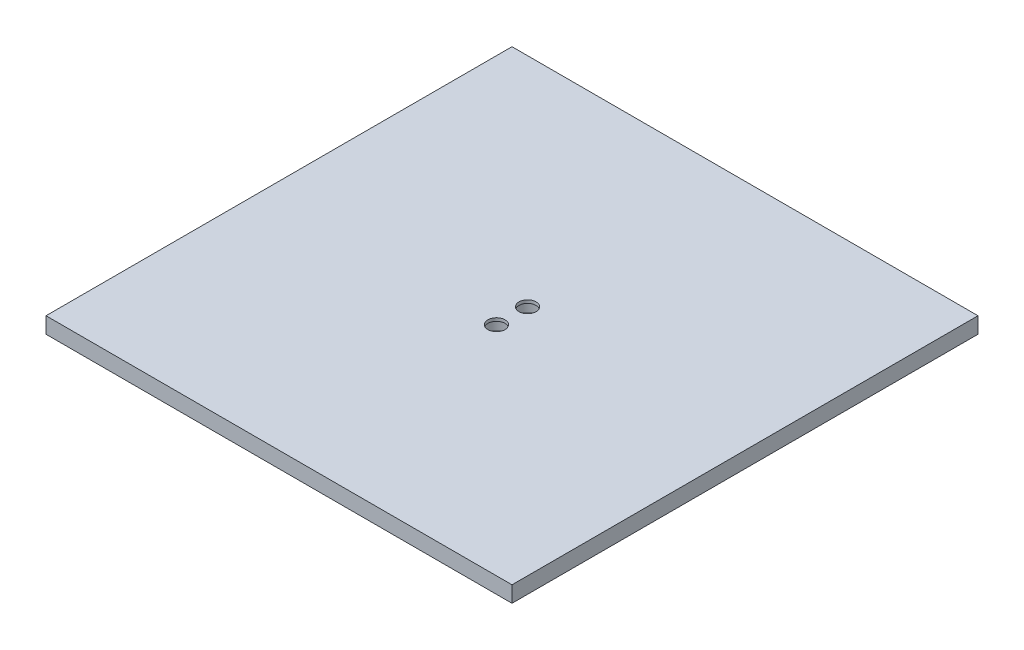
ISO-10303-21;
HEADER;
FILE_DESCRIPTION(('STEP AP214'),'2;1');
FILE_NAME('part.step','',(''),(''),'','','');
FILE_SCHEMA(('AUTOMOTIVE_DESIGN { 1 0 10303 214 1 1 1 1 }'));
ENDSEC;
DATA;
#1=APPLICATION_CONTEXT('core data for automotive mechanical design processes');
#2=APPLICATION_PROTOCOL_DEFINITION('international standard','automotive_design',2000,#1);
#3=PRODUCT_CONTEXT('',#1,'mechanical');
#4=PRODUCT('Part','Part','',(#3));
#5=PRODUCT_RELATED_PRODUCT_CATEGORY('part','',(#4));
#6=PRODUCT_DEFINITION_FORMATION('','',#4);
#7=PRODUCT_DEFINITION_CONTEXT('part definition',#1,'design');
#8=PRODUCT_DEFINITION('design','',#6,#7);
#9=PRODUCT_DEFINITION_SHAPE('','',#8);
#10=(LENGTH_UNIT() NAMED_UNIT(*) SI_UNIT(.MILLI.,.METRE.));
#11=(NAMED_UNIT(*) PLANE_ANGLE_UNIT() SI_UNIT($,.RADIAN.));
#12=(NAMED_UNIT(*) SI_UNIT($,.STERADIAN.) SOLID_ANGLE_UNIT());
#13=UNCERTAINTY_MEASURE_WITH_UNIT(LENGTH_MEASURE(1.E-05),#10,'distance_accuracy_value','');
#14=(GEOMETRIC_REPRESENTATION_CONTEXT(3) GLOBAL_UNCERTAINTY_ASSIGNED_CONTEXT((#13)) GLOBAL_UNIT_ASSIGNED_CONTEXT((#10,
#11,#12)) REPRESENTATION_CONTEXT('',''));
#15=CARTESIAN_POINT('',(0.,0.,0.));
#16=DIRECTION('',(0.,0.,1.));
#17=DIRECTION('',(1.,0.,0.));
#18=AXIS2_PLACEMENT_3D('',#15,#16,#17);
#19=CARTESIAN_POINT('',(45.,0.,-48.));
#20=DIRECTION('',(0.,-1.,0.));
#21=DIRECTION('',(0.,0.,-1.));
#22=AXIS2_PLACEMENT_3D('',#19,#20,#21);
#23=CYLINDRICAL_SURFACE('',#22,1.65);
#24=CARTESIAN_POINT('',(45.,0.,-48.));
#25=DIRECTION('',(0.,-1.,0.));
#26=DIRECTION('',(0.,0.,-1.));
#27=AXIS2_PLACEMENT_3D('',#24,#25,#26);
#28=CIRCLE('',#27,1.65);
#29=CARTESIAN_POINT('',(45.,0.,-49.65));
#30=VERTEX_POINT('',#29);
#31=EDGE_CURVE('E144',#30,#30,#28,.T.);
#32=CARTESIAN_POINT('',(45.,-0.6,-48.));
#33=DIRECTION('',(0.,-1.,0.));
#34=DIRECTION('',(0.,0.,-1.));
#35=AXIS2_PLACEMENT_3D('',#32,#33,#34);
#36=CIRCLE('',#35,1.65);
#37=CARTESIAN_POINT('',(45.,-0.6,-49.65));
#38=VERTEX_POINT('',#37);
#39=EDGE_CURVE('E49',#38,#38,#36,.F.);
#40=CARTESIAN_POINT('',(45.,0.,-49.65));
#41=CARTESIAN_POINT('',(45.,-0.00625,-49.65));
#42=CARTESIAN_POINT('',(45.,-0.0125,-49.65));
#43=CARTESIAN_POINT('',(45.,-0.025,-49.65));
#44=CARTESIAN_POINT('',(45.,-0.03125,-49.65));
#45=CARTESIAN_POINT('',(45.,-0.04375,-49.65));
#46=CARTESIAN_POINT('',(45.,-0.05,-49.65));
#47=CARTESIAN_POINT('',(45.,-0.0625,-49.65));
#48=CARTESIAN_POINT('',(45.,-0.06875,-49.65));
#49=CARTESIAN_POINT('',(45.,-0.08125,-49.65));
#50=CARTESIAN_POINT('',(45.,-0.0875,-49.65));
#51=CARTESIAN_POINT('',(45.,-0.1,-49.65));
#52=CARTESIAN_POINT('',(45.,-0.10625,-49.65));
#53=CARTESIAN_POINT('',(45.,-0.11875,-49.65));
#54=CARTESIAN_POINT('',(45.,-0.125,-49.65));
#55=CARTESIAN_POINT('',(45.,-0.1375,-49.65));
#56=CARTESIAN_POINT('',(45.,-0.14375,-49.65));
#57=CARTESIAN_POINT('',(45.,-0.15625,-49.65));
#58=CARTESIAN_POINT('',(45.,-0.1625,-49.65));
#59=CARTESIAN_POINT('',(45.,-0.175,-49.65));
#60=CARTESIAN_POINT('',(45.,-0.18125,-49.65));
#61=CARTESIAN_POINT('',(45.,-0.19375,-49.65));
#62=CARTESIAN_POINT('',(45.,-0.2,-49.65));
#63=CARTESIAN_POINT('',(45.,-0.2125,-49.65));
#64=CARTESIAN_POINT('',(45.,-0.21875,-49.65));
#65=CARTESIAN_POINT('',(45.,-0.23125,-49.65));
#66=CARTESIAN_POINT('',(45.,-0.2375,-49.65));
#67=CARTESIAN_POINT('',(45.,-0.25,-49.65));
#68=CARTESIAN_POINT('',(45.,-0.25625,-49.65));
#69=CARTESIAN_POINT('',(45.,-0.26875,-49.65));
#70=CARTESIAN_POINT('',(45.,-0.275,-49.65));
#71=CARTESIAN_POINT('',(45.,-0.2875,-49.65));
#72=CARTESIAN_POINT('',(45.,-0.29375,-49.65));
#73=CARTESIAN_POINT('',(45.,-0.30625,-49.65));
#74=CARTESIAN_POINT('',(45.,-0.3125,-49.65));
#75=CARTESIAN_POINT('',(45.,-0.325,-49.65));
#76=CARTESIAN_POINT('',(45.,-0.33125,-49.65));
#77=CARTESIAN_POINT('',(45.,-0.34375,-49.65));
#78=CARTESIAN_POINT('',(45.,-0.35,-49.65));
#79=CARTESIAN_POINT('',(45.,-0.3625,-49.65));
#80=CARTESIAN_POINT('',(45.,-0.36875,-49.65));
#81=CARTESIAN_POINT('',(45.,-0.38125,-49.65));
#82=CARTESIAN_POINT('',(45.,-0.3875,-49.65));
#83=CARTESIAN_POINT('',(45.,-0.4,-49.65));
#84=CARTESIAN_POINT('',(45.,-0.40625,-49.65));
#85=CARTESIAN_POINT('',(45.,-0.41875,-49.65));
#86=CARTESIAN_POINT('',(45.,-0.425,-49.65));
#87=CARTESIAN_POINT('',(45.,-0.4375,-49.65));
#88=CARTESIAN_POINT('',(45.,-0.44375,-49.65));
#89=CARTESIAN_POINT('',(45.,-0.45625,-49.65));
#90=CARTESIAN_POINT('',(45.,-0.4625,-49.65));
#91=CARTESIAN_POINT('',(45.,-0.475,-49.65));
#92=CARTESIAN_POINT('',(45.,-0.48125,-49.65));
#93=CARTESIAN_POINT('',(45.,-0.49375,-49.65));
#94=CARTESIAN_POINT('',(45.,-0.5,-49.65));
#95=CARTESIAN_POINT('',(45.,-0.5125,-49.65));
#96=CARTESIAN_POINT('',(45.,-0.51875,-49.65));
#97=CARTESIAN_POINT('',(45.,-0.53125,-49.65));
#98=CARTESIAN_POINT('',(45.,-0.5375,-49.65));
#99=CARTESIAN_POINT('',(45.,-0.55,-49.65));
#100=CARTESIAN_POINT('',(45.,-0.55625,-49.65));
#101=CARTESIAN_POINT('',(45.,-0.56875,-49.65));
#102=CARTESIAN_POINT('',(45.,-0.575,-49.65));
#103=CARTESIAN_POINT('',(45.,-0.5875,-49.65));
#104=CARTESIAN_POINT('',(45.,-0.59375,-49.65));
#105=CARTESIAN_POINT('',(45.,-0.6,-49.65));
#106=B_SPLINE_CURVE_WITH_KNOTS('',3,(#40,#41,#42,#43,#44,#45,#46,#47,#48,#49,#50,#51,#52,#53,
#54,#55,#56,#57,#58,#59,#60,#61,#62,#63,#64,#65,#66,#67,#68,#69,#70,#71,#72,#73,#74,#75,#76,#77,
#78,#79,#80,#81,#82,#83,#84,#85,#86,#87,#88,#89,#90,#91,#92,#93,#94,#95,#96,#97,#98,#99,#100,
#101,#102,#103,#104,#105),.UNSPECIFIED.,.F.,.F.,(4,2,2,2,2,2,2,2,2,2,2,2,2,2,2,2,2,2,2,2,2,2,2,
2,2,2,2,2,2,2,2,2,4),(0.,0.01875,0.0375,0.05625,0.075,0.09375,0.1125,0.13125,0.15,0.16875,
0.1875,0.20625,0.225,0.24375,0.2625,0.28125,0.3,0.31875,0.3375,0.35625,0.375,0.39375,0.4125,
0.43125,0.45,0.46875,0.4875,0.50625,0.525,0.54375,0.5625,0.58125,0.6),.UNSPECIFIED.);
#107=EDGE_CURVE('BSEAM45',#30,#38,#106,.T.);
#108=ORIENTED_EDGE('',*,*,#31,.F.);
#109=ORIENTED_EDGE('',*,*,#39,.F.);
#110=ORIENTED_EDGE('',*,*,#107,.T.);
#111=ORIENTED_EDGE('',*,*,#107,.F.);
#112=EDGE_LOOP('',(#108,#110,#109,#111));
#113=FACE_BOUND('',#112,.T.);
#114=ADVANCED_FACE('F45',(#113),#23,.F.);
#115=CARTESIAN_POINT('',(45.,0.,-42.));
#116=DIRECTION('',(0.,-1.,0.));
#117=DIRECTION('',(0.,0.,-1.));
#118=AXIS2_PLACEMENT_3D('',#115,#116,#117);
#119=CYLINDRICAL_SURFACE('',#118,1.65);
#120=CARTESIAN_POINT('',(45.,0.,-42.));
#121=DIRECTION('',(0.,-1.,0.));
#122=DIRECTION('',(0.,0.,-1.));
#123=AXIS2_PLACEMENT_3D('',#120,#121,#122);
#124=CIRCLE('',#123,1.65);
#125=CARTESIAN_POINT('',(45.,0.,-43.65));
#126=VERTEX_POINT('',#125);
#127=EDGE_CURVE('E124',#126,#126,#124,.T.);
#128=CARTESIAN_POINT('',(45.,-0.6,-42.));
#129=DIRECTION('',(0.,-1.,0.));
#130=DIRECTION('',(0.,0.,-1.));
#131=AXIS2_PLACEMENT_3D('',#128,#129,#130);
#132=CIRCLE('',#131,1.65);
#133=CARTESIAN_POINT('',(45.,-0.6,-43.65));
#134=VERTEX_POINT('',#133);
#135=EDGE_CURVE('E135',#134,#134,#132,.F.);
#136=CARTESIAN_POINT('',(45.,0.,-43.65));
#137=CARTESIAN_POINT('',(45.,-0.00625,-43.65));
#138=CARTESIAN_POINT('',(45.,-0.0125,-43.65));
#139=CARTESIAN_POINT('',(45.,-0.025,-43.65));
#140=CARTESIAN_POINT('',(45.,-0.03125,-43.65));
#141=CARTESIAN_POINT('',(45.,-0.04375,-43.65));
#142=CARTESIAN_POINT('',(45.,-0.05,-43.65));
#143=CARTESIAN_POINT('',(45.,-0.0625,-43.65));
#144=CARTESIAN_POINT('',(45.,-0.06875,-43.65));
#145=CARTESIAN_POINT('',(45.,-0.08125,-43.65));
#146=CARTESIAN_POINT('',(45.,-0.0875,-43.65));
#147=CARTESIAN_POINT('',(45.,-0.1,-43.65));
#148=CARTESIAN_POINT('',(45.,-0.10625,-43.65));
#149=CARTESIAN_POINT('',(45.,-0.11875,-43.65));
#150=CARTESIAN_POINT('',(45.,-0.125,-43.65));
#151=CARTESIAN_POINT('',(45.,-0.1375,-43.65));
#152=CARTESIAN_POINT('',(45.,-0.14375,-43.65));
#153=CARTESIAN_POINT('',(45.,-0.15625,-43.65));
#154=CARTESIAN_POINT('',(45.,-0.1625,-43.65));
#155=CARTESIAN_POINT('',(45.,-0.175,-43.65));
#156=CARTESIAN_POINT('',(45.,-0.18125,-43.65));
#157=CARTESIAN_POINT('',(45.,-0.19375,-43.65));
#158=CARTESIAN_POINT('',(45.,-0.2,-43.65));
#159=CARTESIAN_POINT('',(45.,-0.2125,-43.65));
#160=CARTESIAN_POINT('',(45.,-0.21875,-43.65));
#161=CARTESIAN_POINT('',(45.,-0.23125,-43.65));
#162=CARTESIAN_POINT('',(45.,-0.2375,-43.65));
#163=CARTESIAN_POINT('',(45.,-0.25,-43.65));
#164=CARTESIAN_POINT('',(45.,-0.25625,-43.65));
#165=CARTESIAN_POINT('',(45.,-0.26875,-43.65));
#166=CARTESIAN_POINT('',(45.,-0.275,-43.65));
#167=CARTESIAN_POINT('',(45.,-0.2875,-43.65));
#168=CARTESIAN_POINT('',(45.,-0.29375,-43.65));
#169=CARTESIAN_POINT('',(45.,-0.30625,-43.65));
#170=CARTESIAN_POINT('',(45.,-0.3125,-43.65));
#171=CARTESIAN_POINT('',(45.,-0.325,-43.65));
#172=CARTESIAN_POINT('',(45.,-0.33125,-43.65));
#173=CARTESIAN_POINT('',(45.,-0.34375,-43.65));
#174=CARTESIAN_POINT('',(45.,-0.35,-43.65));
#175=CARTESIAN_POINT('',(45.,-0.3625,-43.65));
#176=CARTESIAN_POINT('',(45.,-0.36875,-43.65));
#177=CARTESIAN_POINT('',(45.,-0.38125,-43.65));
#178=CARTESIAN_POINT('',(45.,-0.3875,-43.65));
#179=CARTESIAN_POINT('',(45.,-0.4,-43.65));
#180=CARTESIAN_POINT('',(45.,-0.40625,-43.65));
#181=CARTESIAN_POINT('',(45.,-0.41875,-43.65));
#182=CARTESIAN_POINT('',(45.,-0.425,-43.65));
#183=CARTESIAN_POINT('',(45.,-0.4375,-43.65));
#184=CARTESIAN_POINT('',(45.,-0.44375,-43.65));
#185=CARTESIAN_POINT('',(45.,-0.45625,-43.65));
#186=CARTESIAN_POINT('',(45.,-0.4625,-43.65));
#187=CARTESIAN_POINT('',(45.,-0.475,-43.65));
#188=CARTESIAN_POINT('',(45.,-0.48125,-43.65));
#189=CARTESIAN_POINT('',(45.,-0.49375,-43.65));
#190=CARTESIAN_POINT('',(45.,-0.5,-43.65));
#191=CARTESIAN_POINT('',(45.,-0.5125,-43.65));
#192=CARTESIAN_POINT('',(45.,-0.51875,-43.65));
#193=CARTESIAN_POINT('',(45.,-0.53125,-43.65));
#194=CARTESIAN_POINT('',(45.,-0.5375,-43.65));
#195=CARTESIAN_POINT('',(45.,-0.55,-43.65));
#196=CARTESIAN_POINT('',(45.,-0.55625,-43.65));
#197=CARTESIAN_POINT('',(45.,-0.56875,-43.65));
#198=CARTESIAN_POINT('',(45.,-0.575,-43.65));
#199=CARTESIAN_POINT('',(45.,-0.5875,-43.65));
#200=CARTESIAN_POINT('',(45.,-0.59375,-43.65));
#201=CARTESIAN_POINT('',(45.,-0.6,-43.65));
#202=B_SPLINE_CURVE_WITH_KNOTS('',3,(#136,#137,#138,#139,#140,#141,#142,#143,#144,#145,#146,
#147,#148,#149,#150,#151,#152,#153,#154,#155,#156,#157,#158,#159,#160,#161,#162,#163,#164,#165,
#166,#167,#168,#169,#170,#171,#172,#173,#174,#175,#176,#177,#178,#179,#180,#181,#182,#183,#184,
#185,#186,#187,#188,#189,#190,#191,#192,#193,#194,#195,#196,#197,#198,#199,#200,#201),
.UNSPECIFIED.,.F.,.F.,(4,2,2,2,2,2,2,2,2,2,2,2,2,2,2,2,2,2,2,2,2,2,2,2,2,2,2,2,2,2,2,2,4),(0.,
0.01875,0.0375,0.05625,0.075,0.09375,0.1125,0.13125,0.15,0.16875,0.1875,0.20625,0.225,0.24375,
0.2625,0.28125,0.3,0.31875,0.3375,0.35625,0.375,0.39375,0.4125,0.43125,0.45,0.46875,0.4875,
0.50625,0.525,0.54375,0.5625,0.58125,0.6),.UNSPECIFIED.);
#203=EDGE_CURVE('BSEAM173',#126,#134,#202,.T.);
#204=ORIENTED_EDGE('',*,*,#127,.F.);
#205=ORIENTED_EDGE('',*,*,#135,.F.);
#206=ORIENTED_EDGE('',*,*,#203,.T.);
#207=ORIENTED_EDGE('',*,*,#203,.F.);
#208=EDGE_LOOP('',(#204,#206,#205,#207));
#209=FACE_BOUND('',#208,.T.);
#210=ADVANCED_FACE('F173',(#209),#119,.F.);
#211=CARTESIAN_POINT('',(0.,-3.1,0.));
#212=DIRECTION('',(-1.,0.,0.));
#213=DIRECTION('',(0.,0.,1.));
#214=AXIS2_PLACEMENT_3D('',#211,#212,#213);
#215=PLANE('',#214);
#216=DIRECTION('',(0.,0.,1.));
#217=VECTOR('',#216,1.);
#218=CARTESIAN_POINT('',(0.,0.,0.));
#219=LINE('',#218,#217);
#220=CARTESIAN_POINT('',(0.,0.,-90.));
#221=VERTEX_POINT('',#220);
#222=CARTESIAN_POINT('',(0.,0.,0.));
#223=VERTEX_POINT('',#222);
#224=EDGE_CURVE('E119',#221,#223,#219,.T.);
#225=ORIENTED_EDGE('',*,*,#224,.F.);
#226=DIRECTION('',(0.,1.,0.));
#227=VECTOR('',#226,1.);
#228=CARTESIAN_POINT('',(0.,-3.1,-90.));
#229=LINE('',#228,#227);
#230=CARTESIAN_POINT('',(0.,-3.1,-90.));
#231=VERTEX_POINT('',#230);
#232=EDGE_CURVE('E11',#231,#221,#229,.T.);
#233=ORIENTED_EDGE('',*,*,#232,.F.);
#234=DIRECTION('',(0.,0.,1.));
#235=VECTOR('',#234,1.);
#236=CARTESIAN_POINT('',(0.,-3.1,0.));
#237=LINE('',#236,#235);
#238=CARTESIAN_POINT('',(0.,-3.1,0.));
#239=VERTEX_POINT('',#238);
#240=EDGE_CURVE('E110',#231,#239,#237,.T.);
#241=ORIENTED_EDGE('',*,*,#240,.T.);
#242=DIRECTION('',(0.,1.,0.));
#243=VECTOR('',#242,1.);
#244=CARTESIAN_POINT('',(0.,-3.1,0.));
#245=LINE('',#244,#243);
#246=EDGE_CURVE('E90',#239,#223,#245,.T.);
#247=ORIENTED_EDGE('',*,*,#246,.T.);
#248=EDGE_LOOP('',(#225,#233,#241,#247));
#249=FACE_BOUND('',#248,.T.);
#250=ADVANCED_FACE('F47',(#249),#215,.T.);
#251=CARTESIAN_POINT('',(0.,-3.1,-90.));
#252=DIRECTION('',(0.,0.,-1.));
#253=DIRECTION('',(-1.,0.,0.));
#254=AXIS2_PLACEMENT_3D('',#251,#252,#253);
#255=PLANE('',#254);
#256=DIRECTION('',(-1.,0.,0.));
#257=VECTOR('',#256,1.);
#258=CARTESIAN_POINT('',(0.,0.,-90.));
#259=LINE('',#258,#257);
#260=CARTESIAN_POINT('',(90.,0.,-90.));
#261=VERTEX_POINT('',#260);
#262=EDGE_CURVE('E113',#261,#221,#259,.T.);
#263=ORIENTED_EDGE('',*,*,#262,.F.);
#264=DIRECTION('',(0.,1.,0.));
#265=VECTOR('',#264,1.);
#266=CARTESIAN_POINT('',(90.,-3.1,-90.));
#267=LINE('',#266,#265);
#268=CARTESIAN_POINT('',(90.,-3.1,-90.));
#269=VERTEX_POINT('',#268);
#270=EDGE_CURVE('E56',#269,#261,#267,.T.);
#271=ORIENTED_EDGE('',*,*,#270,.F.);
#272=DIRECTION('',(-1.,0.,0.));
#273=VECTOR('',#272,1.);
#274=CARTESIAN_POINT('',(0.,-3.1,-90.));
#275=LINE('',#274,#273);
#276=EDGE_CURVE('E105',#269,#231,#275,.T.);
#277=ORIENTED_EDGE('',*,*,#276,.T.);
#278=ORIENTED_EDGE('',*,*,#232,.T.);
#279=EDGE_LOOP('',(#263,#271,#277,#278));
#280=FACE_BOUND('',#279,.T.);
#281=ADVANCED_FACE('F202',(#280),#255,.T.);
#282=CARTESIAN_POINT('',(90.,-3.1,0.));
#283=DIRECTION('',(1.,0.,0.));
#284=DIRECTION('',(0.,0.,-1.));
#285=AXIS2_PLACEMENT_3D('',#282,#283,#284);
#286=PLANE('',#285);
#287=DIRECTION('',(0.,0.,-1.));
#288=VECTOR('',#287,1.);
#289=CARTESIAN_POINT('',(90.,0.,0.));
#290=LINE('',#289,#288);
#291=CARTESIAN_POINT('',(90.,0.,0.));
#292=VERTEX_POINT('',#291);
#293=EDGE_CURVE('E98',#292,#261,#290,.T.);
#294=ORIENTED_EDGE('',*,*,#293,.F.);
#295=DIRECTION('',(0.,1.,0.));
#296=VECTOR('',#295,1.);
#297=CARTESIAN_POINT('',(90.,-3.1,0.));
#298=LINE('',#297,#296);
#299=CARTESIAN_POINT('',(90.,-3.1,0.));
#300=VERTEX_POINT('',#299);
#301=EDGE_CURVE('E93',#300,#292,#298,.T.);
#302=ORIENTED_EDGE('',*,*,#301,.F.);
#303=DIRECTION('',(0.,0.,-1.));
#304=VECTOR('',#303,1.);
#305=CARTESIAN_POINT('',(90.,-3.1,0.));
#306=LINE('',#305,#304);
#307=EDGE_CURVE('E96',#300,#269,#306,.T.);
#308=ORIENTED_EDGE('',*,*,#307,.T.);
#309=ORIENTED_EDGE('',*,*,#270,.T.);
#310=EDGE_LOOP('',(#294,#302,#308,#309));
#311=FACE_BOUND('',#310,.T.);
#312=ADVANCED_FACE('F95',(#311),#286,.T.);
#313=CARTESIAN_POINT('',(0.,-3.1,0.));
#314=DIRECTION('',(0.,0.,1.));
#315=DIRECTION('',(1.,0.,0.));
#316=AXIS2_PLACEMENT_3D('',#313,#314,#315);
#317=PLANE('',#316);
#318=DIRECTION('',(1.,0.,0.));
#319=VECTOR('',#318,1.);
#320=CARTESIAN_POINT('',(0.,0.,0.));
#321=LINE('',#320,#319);
#322=EDGE_CURVE('E123',#223,#292,#321,.T.);
#323=ORIENTED_EDGE('',*,*,#322,.F.);
#324=ORIENTED_EDGE('',*,*,#246,.F.);
#325=DIRECTION('',(1.,0.,0.));
#326=VECTOR('',#325,1.);
#327=CARTESIAN_POINT('',(0.,-3.1,0.));
#328=LINE('',#327,#326);
#329=EDGE_CURVE('E104',#239,#300,#328,.T.);
#330=ORIENTED_EDGE('',*,*,#329,.T.);
#331=ORIENTED_EDGE('',*,*,#301,.T.);
#332=EDGE_LOOP('',(#323,#324,#330,#331));
#333=FACE_BOUND('',#332,.T.);
#334=ADVANCED_FACE('F108',(#333),#317,.T.);
#335=CARTESIAN_POINT('',(0.,-3.1,0.));
#336=DIRECTION('',(0.,-1.,0.));
#337=DIRECTION('',(0.,0.,-1.));
#338=AXIS2_PLACEMENT_3D('',#335,#336,#337);
#339=PLANE('',#338);
#340=CARTESIAN_POINT('',(45.,-3.1,-42.));
#341=DIRECTION('',(0.,-1.,0.));
#342=DIRECTION('',(0.,0.,-1.));
#343=AXIS2_PLACEMENT_3D('',#340,#341,#342);
#344=CIRCLE('',#343,2.95);
#345=CARTESIAN_POINT('',(45.,-3.1,-44.95));
#346=VERTEX_POINT('',#345);
#347=EDGE_CURVE('E146',#346,#346,#344,.T.);
#348=ORIENTED_EDGE('',*,*,#347,.F.);
#349=EDGE_LOOP('',(#348));
#350=FACE_BOUND('',#349,.T.);
#351=CARTESIAN_POINT('',(45.,-3.1,-48.));
#352=DIRECTION('',(0.,-1.,0.));
#353=DIRECTION('',(0.,0.,-1.));
#354=AXIS2_PLACEMENT_3D('',#351,#352,#353);
#355=CIRCLE('',#354,2.95);
#356=CARTESIAN_POINT('',(45.,-3.1,-50.95));
#357=VERTEX_POINT('',#356);
#358=EDGE_CURVE('E152',#357,#357,#355,.T.);
#359=ORIENTED_EDGE('',*,*,#358,.F.);
#360=EDGE_LOOP('',(#359));
#361=FACE_BOUND('',#360,.T.);
#362=ORIENTED_EDGE('',*,*,#240,.F.);
#363=ORIENTED_EDGE('',*,*,#276,.F.);
#364=ORIENTED_EDGE('',*,*,#307,.F.);
#365=ORIENTED_EDGE('',*,*,#329,.F.);
#366=EDGE_LOOP('',(#362,#363,#364,#365));
#367=FACE_BOUND('',#366,.T.);
#368=ADVANCED_FACE('F103',(#350,#361,#367),#339,.T.);
#369=CARTESIAN_POINT('',(0.,0.,0.));
#370=DIRECTION('',(0.,-1.,0.));
#371=DIRECTION('',(0.,0.,-1.));
#372=AXIS2_PLACEMENT_3D('',#369,#370,#371);
#373=PLANE('',#372);
#374=ORIENTED_EDGE('',*,*,#127,.T.);
#375=EDGE_LOOP('',(#374));
#376=FACE_BOUND('',#375,.T.);
#377=ORIENTED_EDGE('',*,*,#31,.T.);
#378=EDGE_LOOP('',(#377));
#379=FACE_BOUND('',#378,.T.);
#380=ORIENTED_EDGE('',*,*,#224,.T.);
#381=ORIENTED_EDGE('',*,*,#322,.T.);
#382=ORIENTED_EDGE('',*,*,#293,.T.);
#383=ORIENTED_EDGE('',*,*,#262,.T.);
#384=EDGE_LOOP('',(#380,#381,#382,#383));
#385=FACE_BOUND('',#384,.T.);
#386=ADVANCED_FACE('F168',(#376,#379,#385),#373,.F.);
#387=CARTESIAN_POINT('',(45.,-0.6,-42.));
#388=DIRECTION('',(0.,-1.,0.));
#389=DIRECTION('',(0.,0.,-1.));
#390=AXIS2_PLACEMENT_3D('',#387,#388,#389);
#391=PLANE('',#390);
#392=CARTESIAN_POINT('',(45.,-0.6,-42.));
#393=DIRECTION('',(0.,-1.,0.));
#394=DIRECTION('',(0.,0.,-1.));
#395=AXIS2_PLACEMENT_3D('',#392,#393,#394);
#396=CIRCLE('',#395,2.95);
#397=CARTESIAN_POINT('',(45.,-0.6,-44.95));
#398=VERTEX_POINT('',#397);
#399=EDGE_CURVE('E138',#398,#398,#396,.T.);
#400=ORIENTED_EDGE('',*,*,#399,.T.);
#401=EDGE_LOOP('',(#400));
#402=FACE_BOUND('',#401,.T.);
#403=ORIENTED_EDGE('',*,*,#135,.T.);
#404=EDGE_LOOP('',(#403));
#405=FACE_BOUND('',#404,.T.);
#406=ADVANCED_FACE('F189',(#402,#405),#391,.T.);
#407=CARTESIAN_POINT('',(45.,-0.6,-42.));
#408=DIRECTION('',(0.,-1.,0.));
#409=DIRECTION('',(0.,0.,-1.));
#410=AXIS2_PLACEMENT_3D('',#407,#408,#409);
#411=CYLINDRICAL_SURFACE('',#410,2.95);
#412=ORIENTED_EDGE('',*,*,#399,.F.);
#413=EDGE_LOOP('',(#412));
#414=FACE_BOUND('',#413,.T.);
#415=ORIENTED_EDGE('',*,*,#347,.T.);
#416=EDGE_LOOP('',(#415));
#417=FACE_BOUND('',#416,.T.);
#418=ADVANCED_FACE('F180',(#414,#417),#411,.F.);
#419=CARTESIAN_POINT('',(45.,-0.6,-48.));
#420=DIRECTION('',(0.,-1.,0.));
#421=DIRECTION('',(0.,0.,-1.));
#422=AXIS2_PLACEMENT_3D('',#419,#420,#421);
#423=PLANE('',#422);
#424=CARTESIAN_POINT('',(45.,-0.6,-48.));
#425=DIRECTION('',(0.,-1.,0.));
#426=DIRECTION('',(0.,0.,-1.));
#427=AXIS2_PLACEMENT_3D('',#424,#425,#426);
#428=CIRCLE('',#427,2.95);
#429=CARTESIAN_POINT('',(45.,-0.6,-50.95));
#430=VERTEX_POINT('',#429);
#431=EDGE_CURVE('E158',#430,#430,#428,.T.);
#432=ORIENTED_EDGE('',*,*,#431,.T.);
#433=EDGE_LOOP('',(#432));
#434=FACE_BOUND('',#433,.T.);
#435=ORIENTED_EDGE('',*,*,#39,.T.);
#436=EDGE_LOOP('',(#435));
#437=FACE_BOUND('',#436,.T.);
#438=ADVANCED_FACE('F177',(#434,#437),#423,.T.);
#439=CARTESIAN_POINT('',(45.,-0.6,-48.));
#440=DIRECTION('',(0.,-1.,0.));
#441=DIRECTION('',(0.,0.,-1.));
#442=AXIS2_PLACEMENT_3D('',#439,#440,#441);
#443=CYLINDRICAL_SURFACE('',#442,2.95);
#444=ORIENTED_EDGE('',*,*,#431,.F.);
#445=EDGE_LOOP('',(#444));
#446=FACE_BOUND('',#445,.T.);
#447=ORIENTED_EDGE('',*,*,#358,.T.);
#448=EDGE_LOOP('',(#447));
#449=FACE_BOUND('',#448,.T.);
#450=ADVANCED_FACE('F179',(#446,#449),#443,.F.);
#451=CLOSED_SHELL('',(#114,#210,#250,#281,#312,#334,#368,#386,#406,#418,#438,#450));
#452=MANIFOLD_SOLID_BREP('B2',#451);
#453=ADVANCED_BREP_SHAPE_REPRESENTATION('',(#18,#452),#14);
#454=SHAPE_DEFINITION_REPRESENTATION(#9,#453);
ENDSEC;
END-ISO-10303-21;
